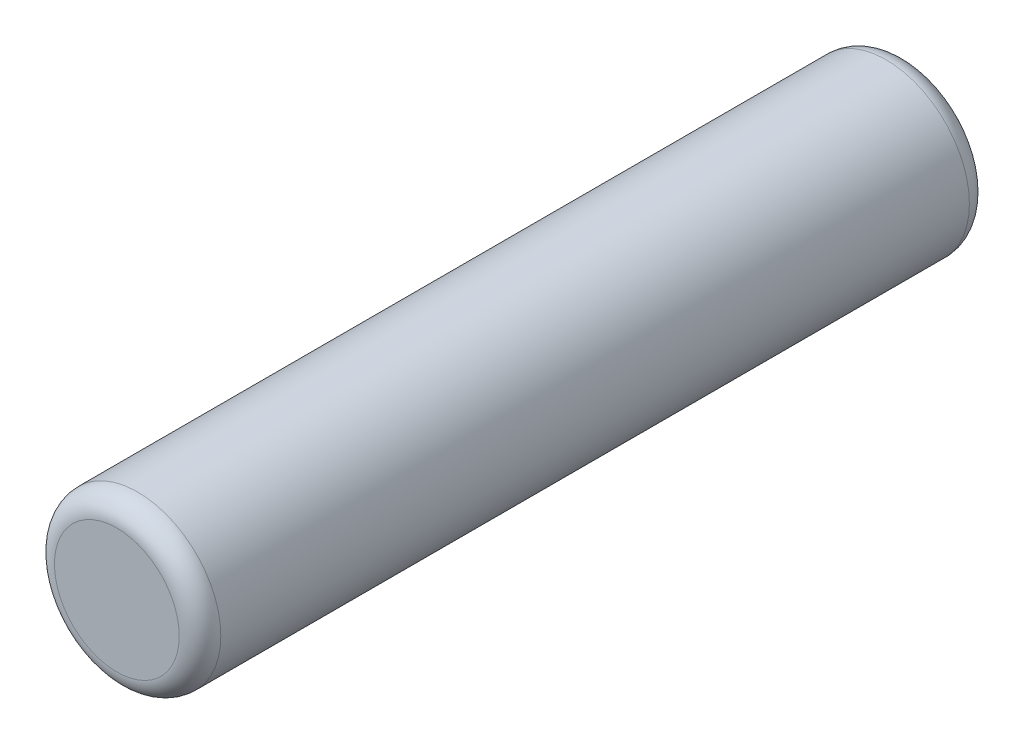
ISO-10303-21;
HEADER;
FILE_DESCRIPTION(('STEP AP214'),'2;1');
FILE_NAME('part.step','',(''),(''),'','','');
FILE_SCHEMA(('AUTOMOTIVE_DESIGN { 1 0 10303 214 1 1 1 1 }'));
ENDSEC;
DATA;
#1=APPLICATION_CONTEXT('core data for automotive mechanical design processes');
#2=APPLICATION_PROTOCOL_DEFINITION('international standard','automotive_design',2000,#1);
#3=PRODUCT_CONTEXT('',#1,'mechanical');
#4=PRODUCT('Part','Part','',(#3));
#5=PRODUCT_RELATED_PRODUCT_CATEGORY('part','',(#4));
#6=PRODUCT_DEFINITION_FORMATION('','',#4);
#7=PRODUCT_DEFINITION_CONTEXT('part definition',#1,'design');
#8=PRODUCT_DEFINITION('design','',#6,#7);
#9=PRODUCT_DEFINITION_SHAPE('','',#8);
#10=(LENGTH_UNIT() NAMED_UNIT(*) SI_UNIT(.MILLI.,.METRE.));
#11=(NAMED_UNIT(*) PLANE_ANGLE_UNIT() SI_UNIT($,.RADIAN.));
#12=(NAMED_UNIT(*) SI_UNIT($,.STERADIAN.) SOLID_ANGLE_UNIT());
#13=UNCERTAINTY_MEASURE_WITH_UNIT(LENGTH_MEASURE(1.E-05),#10,'distance_accuracy_value','');
#14=(GEOMETRIC_REPRESENTATION_CONTEXT(3) GLOBAL_UNCERTAINTY_ASSIGNED_CONTEXT((#13)) GLOBAL_UNIT_ASSIGNED_CONTEXT((#10,
#11,#12)) REPRESENTATION_CONTEXT('',''));
#15=CARTESIAN_POINT('',(0.,0.,0.));
#16=DIRECTION('',(0.,0.,1.));
#17=DIRECTION('',(1.,0.,0.));
#18=AXIS2_PLACEMENT_3D('',#15,#16,#17);
#19=CARTESIAN_POINT('',(0.,0.,-0.5));
#20=DIRECTION('',(0.,0.,1.));
#21=DIRECTION('',(1.,0.,0.));
#22=AXIS2_PLACEMENT_3D('',#19,#20,#21);
#23=TOROIDAL_SURFACE('',#22,1.5,0.5);
#24=CARTESIAN_POINT('',(0.,0.,0.));
#25=DIRECTION('',(0.,0.,1.));
#26=DIRECTION('',(1.,0.,0.));
#27=AXIS2_PLACEMENT_3D('',#24,#25,#26);
#28=CIRCLE('',#27,1.5);
#29=CARTESIAN_POINT('',(1.5,0.,0.));
#30=VERTEX_POINT('',#29);
#31=EDGE_CURVE('E40',#30,#30,#28,.T.);
#32=ORIENTED_EDGE('',*,*,#31,.F.);
#33=EDGE_LOOP('',(#32));
#34=FACE_BOUND('',#33,.T.);
#35=CARTESIAN_POINT('',(0.,0.,-0.5));
#36=DIRECTION('',(0.,0.,1.));
#37=DIRECTION('',(1.,0.,0.));
#38=AXIS2_PLACEMENT_3D('',#35,#36,#37);
#39=CIRCLE('',#38,2.);
#40=CARTESIAN_POINT('',(2.,0.,-0.5));
#41=VERTEX_POINT('',#40);
#42=EDGE_CURVE('E10',#41,#41,#39,.F.);
#43=ORIENTED_EDGE('',*,*,#42,.F.);
#44=EDGE_LOOP('',(#43));
#45=FACE_BOUND('',#44,.T.);
#46=ADVANCED_FACE('F34',(#34,#45),#23,.T.);
#47=CARTESIAN_POINT('',(0.,0.,-18.5));
#48=DIRECTION('',(0.,0.,1.));
#49=DIRECTION('',(1.,0.,0.));
#50=AXIS2_PLACEMENT_3D('',#47,#48,#49);
#51=TOROIDAL_SURFACE('',#50,1.5,0.5);
#52=CARTESIAN_POINT('',(0.,0.,-19.));
#53=DIRECTION('',(0.,0.,1.));
#54=DIRECTION('',(1.,0.,0.));
#55=AXIS2_PLACEMENT_3D('',#52,#53,#54);
#56=CIRCLE('',#55,1.5);
#57=CARTESIAN_POINT('',(1.5,0.,-19.));
#58=VERTEX_POINT('',#57);
#59=EDGE_CURVE('E48',#58,#58,#56,.F.);
#60=ORIENTED_EDGE('',*,*,#59,.F.);
#61=EDGE_LOOP('',(#60));
#62=FACE_BOUND('',#61,.T.);
#63=CARTESIAN_POINT('',(0.,0.,-18.5));
#64=DIRECTION('',(0.,0.,1.));
#65=DIRECTION('',(1.,0.,0.));
#66=AXIS2_PLACEMENT_3D('',#63,#64,#65);
#67=CIRCLE('',#66,2.);
#68=CARTESIAN_POINT('',(2.,0.,-18.5));
#69=VERTEX_POINT('',#68);
#70=EDGE_CURVE('E44',#69,#69,#67,.T.);
#71=ORIENTED_EDGE('',*,*,#70,.F.);
#72=EDGE_LOOP('',(#71));
#73=FACE_BOUND('',#72,.T.);
#74=ADVANCED_FACE('F56',(#62,#73),#51,.T.);
#75=CARTESIAN_POINT('',(0.,0.,-19.));
#76=DIRECTION('',(0.,0.,1.));
#77=DIRECTION('',(1.,0.,0.));
#78=AXIS2_PLACEMENT_3D('',#75,#76,#77);
#79=CYLINDRICAL_SURFACE('',#78,2.);
#80=ORIENTED_EDGE('',*,*,#42,.T.);
#81=EDGE_LOOP('',(#80));
#82=FACE_BOUND('',#81,.T.);
#83=ORIENTED_EDGE('',*,*,#70,.T.);
#84=EDGE_LOOP('',(#83));
#85=FACE_BOUND('',#84,.T.);
#86=ADVANCED_FACE('F59',(#82,#85),#79,.T.);
#87=CARTESIAN_POINT('',(0.,0.,-19.));
#88=DIRECTION('',(0.,0.,1.));
#89=DIRECTION('',(1.,0.,0.));
#90=AXIS2_PLACEMENT_3D('',#87,#88,#89);
#91=PLANE('',#90);
#92=ORIENTED_EDGE('',*,*,#59,.T.);
#93=EDGE_LOOP('',(#92));
#94=FACE_BOUND('',#93,.T.);
#95=ADVANCED_FACE('F54',(#94),#91,.F.);
#96=CARTESIAN_POINT('',(0.,0.,0.));
#97=DIRECTION('',(0.,0.,1.));
#98=DIRECTION('',(1.,0.,0.));
#99=AXIS2_PLACEMENT_3D('',#96,#97,#98);
#100=PLANE('',#99);
#101=ORIENTED_EDGE('',*,*,#31,.T.);
#102=EDGE_LOOP('',(#101));
#103=FACE_BOUND('',#102,.T.);
#104=ADVANCED_FACE('F67',(#103),#100,.T.);
#105=CLOSED_SHELL('',(#46,#74,#86,#95,#104));
#106=MANIFOLD_SOLID_BREP('B2',#105);
#107=ADVANCED_BREP_SHAPE_REPRESENTATION('',(#18,#106),#14);
#108=SHAPE_DEFINITION_REPRESENTATION(#9,#107);
ENDSEC;
END-ISO-10303-21;
